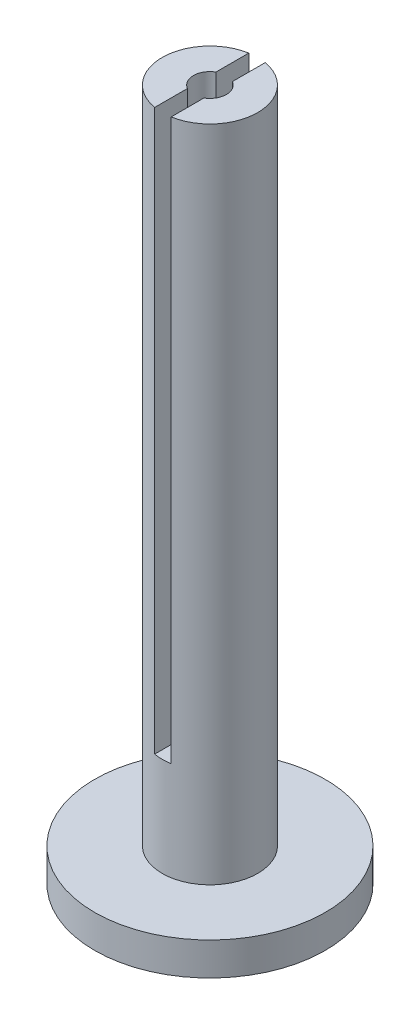
ISO-10303-21;
HEADER;
FILE_DESCRIPTION(('STEP AP214'),'2;1');
FILE_NAME('part.step','',(''),(''),'','','');
FILE_SCHEMA(('AUTOMOTIVE_DESIGN { 1 0 10303 214 1 1 1 1 }'));
ENDSEC;
DATA;
#1=APPLICATION_CONTEXT('core data for automotive mechanical design processes');
#2=APPLICATION_PROTOCOL_DEFINITION('international standard','automotive_design',2000,#1);
#3=PRODUCT_CONTEXT('',#1,'mechanical');
#4=PRODUCT('Part','Part','',(#3));
#5=PRODUCT_RELATED_PRODUCT_CATEGORY('part','',(#4));
#6=PRODUCT_DEFINITION_FORMATION('','',#4);
#7=PRODUCT_DEFINITION_CONTEXT('part definition',#1,'design');
#8=PRODUCT_DEFINITION('design','',#6,#7);
#9=PRODUCT_DEFINITION_SHAPE('','',#8);
#10=(LENGTH_UNIT() NAMED_UNIT(*) SI_UNIT(.MILLI.,.METRE.));
#11=(NAMED_UNIT(*) PLANE_ANGLE_UNIT() SI_UNIT($,.RADIAN.));
#12=(NAMED_UNIT(*) SI_UNIT($,.STERADIAN.) SOLID_ANGLE_UNIT());
#13=UNCERTAINTY_MEASURE_WITH_UNIT(LENGTH_MEASURE(1.E-05),#10,'distance_accuracy_value','');
#14=(GEOMETRIC_REPRESENTATION_CONTEXT(3) GLOBAL_UNCERTAINTY_ASSIGNED_CONTEXT((#13)) GLOBAL_UNIT_ASSIGNED_CONTEXT((#10,
#11,#12)) REPRESENTATION_CONTEXT('',''));
#15=CARTESIAN_POINT('',(0.,0.,0.));
#16=DIRECTION('',(0.,0.,1.));
#17=DIRECTION('',(1.,0.,0.));
#18=AXIS2_PLACEMENT_3D('',#15,#16,#17);
#19=CARTESIAN_POINT('',(-0.25,4.,-1.5));
#20=DIRECTION('',(-1.,0.,0.));
#21=DIRECTION('',(0.,0.,1.));
#22=AXIS2_PLACEMENT_3D('',#19,#20,#21);
#23=PLANE('',#22);
#24=DIRECTION('',(0.,0.,1.));
#25=VECTOR('',#24,1.);
#26=CARTESIAN_POINT('',(-0.25,4.,-1.5));
#27=LINE('',#26,#25);
#28=CARTESIAN_POINT('',(-0.25,4.,0.433012701892219));
#29=VERTEX_POINT('',#28);
#30=CARTESIAN_POINT('',(-0.25,4.,1.42828568570857));
#31=VERTEX_POINT('',#30);
#32=EDGE_CURVE('E148',#29,#31,#27,.T.);
#33=ORIENTED_EDGE('',*,*,#32,.F.);
#34=DIRECTION('',(0.,1.,0.));
#35=VECTOR('',#34,1.);
#36=CARTESIAN_POINT('',(-0.25,4.,0.433012701892219));
#37=LINE('',#36,#35);
#38=CARTESIAN_POINT('',(-0.25,21.,0.433012701892219));
#39=VERTEX_POINT('',#38);
#40=EDGE_CURVE('E214',#29,#39,#37,.T.);
#41=ORIENTED_EDGE('',*,*,#40,.T.);
#42=DIRECTION('',(0.,0.,1.));
#43=VECTOR('',#42,1.);
#44=CARTESIAN_POINT('',(-0.25,21.,0.));
#45=LINE('',#44,#43);
#46=CARTESIAN_POINT('',(-0.25,21.,1.42828568570857));
#47=VERTEX_POINT('',#46);
#48=EDGE_CURVE('E122',#39,#47,#45,.T.);
#49=ORIENTED_EDGE('',*,*,#48,.T.);
#50=DIRECTION('',(0.,-1.,0.));
#51=VECTOR('',#50,1.);
#52=CARTESIAN_POINT('',(-0.25,21.,1.42828568570857));
#53=LINE('',#52,#51);
#54=EDGE_CURVE('E143',#31,#47,#53,.F.);
#55=ORIENTED_EDGE('',*,*,#54,.F.);
#56=EDGE_LOOP('',(#33,#41,#49,#55));
#57=FACE_BOUND('',#56,.T.);
#58=ADVANCED_FACE('F39',(#57),#23,.F.);
#59=CARTESIAN_POINT('',(0.25,4.,-1.5));
#60=DIRECTION('',(1.,0.,0.));
#61=DIRECTION('',(0.,0.,-1.));
#62=AXIS2_PLACEMENT_3D('',#59,#60,#61);
#63=PLANE('',#62);
#64=DIRECTION('',(0.,0.,-1.));
#65=VECTOR('',#64,1.);
#66=CARTESIAN_POINT('',(0.25,4.,-1.5));
#67=LINE('',#66,#65);
#68=CARTESIAN_POINT('',(0.25,4.,-0.433012701892219));
#69=VERTEX_POINT('',#68);
#70=CARTESIAN_POINT('',(0.25,4.,-1.42828568570857));
#71=VERTEX_POINT('',#70);
#72=EDGE_CURVE('E150',#69,#71,#67,.T.);
#73=ORIENTED_EDGE('',*,*,#72,.F.);
#74=DIRECTION('',(0.,1.,0.));
#75=VECTOR('',#74,1.);
#76=CARTESIAN_POINT('',(0.25,4.,-0.433012701892219));
#77=LINE('',#76,#75);
#78=CARTESIAN_POINT('',(0.25,21.,-0.433012701892219));
#79=VERTEX_POINT('',#78);
#80=EDGE_CURVE('E11',#69,#79,#77,.T.);
#81=ORIENTED_EDGE('',*,*,#80,.T.);
#82=DIRECTION('',(0.,0.,-1.));
#83=VECTOR('',#82,1.);
#84=CARTESIAN_POINT('',(0.25,21.,0.));
#85=LINE('',#84,#83);
#86=CARTESIAN_POINT('',(0.25,21.,-1.42828568570857));
#87=VERTEX_POINT('',#86);
#88=EDGE_CURVE('E116',#79,#87,#85,.T.);
#89=ORIENTED_EDGE('',*,*,#88,.T.);
#90=DIRECTION('',(0.,-1.,0.));
#91=VECTOR('',#90,1.);
#92=CARTESIAN_POINT('',(0.25,21.,-1.42828568570857));
#93=LINE('',#92,#91);
#94=EDGE_CURVE('E149',#71,#87,#93,.F.);
#95=ORIENTED_EDGE('',*,*,#94,.F.);
#96=EDGE_LOOP('',(#73,#81,#89,#95));
#97=FACE_BOUND('',#96,.T.);
#98=ADVANCED_FACE('F185',(#97),#63,.F.);
#99=CARTESIAN_POINT('',(0.,21.,0.));
#100=DIRECTION('',(0.,1.,0.));
#101=DIRECTION('',(0.,0.,1.));
#102=AXIS2_PLACEMENT_3D('',#99,#100,#101);
#103=PLANE('',#102);
#104=CARTESIAN_POINT('',(0.,21.,0.));
#105=DIRECTION('',(0.,1.,0.));
#106=DIRECTION('',(0.,0.,1.));
#107=AXIS2_PLACEMENT_3D('',#104,#105,#106);
#108=CIRCLE('',#107,0.5);
#109=CARTESIAN_POINT('',(-0.25,21.,-0.433012701892219));
#110=VERTEX_POINT('',#109);
#111=EDGE_CURVE('E117',#110,#39,#108,.T.);
#112=ORIENTED_EDGE('',*,*,#111,.F.);
#113=CARTESIAN_POINT('',(-0.25,21.,-1.42828568570857));
#114=VERTEX_POINT('',#113);
#115=EDGE_CURVE('E124',#114,#110,#45,.T.);
#116=ORIENTED_EDGE('',*,*,#115,.F.);
#117=CARTESIAN_POINT('',(0.,21.,0.));
#118=DIRECTION('',(0.,1.,0.));
#119=DIRECTION('',(0.,0.,1.));
#120=AXIS2_PLACEMENT_3D('',#117,#118,#119);
#121=CIRCLE('',#120,1.45);
#122=EDGE_CURVE('E162',#114,#47,#121,.T.);
#123=ORIENTED_EDGE('',*,*,#122,.T.);
#124=ORIENTED_EDGE('',*,*,#48,.F.);
#125=EDGE_LOOP('',(#112,#116,#123,#124));
#126=FACE_BOUND('',#125,.T.);
#127=ADVANCED_FACE('F192',(#126),#103,.T.);
#128=CARTESIAN_POINT('',(0.,1.,0.));
#129=DIRECTION('',(0.,-1.,0.));
#130=DIRECTION('',(0.,0.,-1.));
#131=AXIS2_PLACEMENT_3D('',#128,#129,#130);
#132=CYLINDRICAL_SURFACE('',#131,3.5);
#133=CARTESIAN_POINT('',(0.,1.,0.));
#134=DIRECTION('',(0.,1.,0.));
#135=DIRECTION('',(0.,0.,1.));
#136=AXIS2_PLACEMENT_3D('',#133,#134,#135);
#137=CIRCLE('',#136,3.5);
#138=CARTESIAN_POINT('',(0.,1.,3.5));
#139=VERTEX_POINT('',#138);
#140=EDGE_CURVE('E166',#139,#139,#137,.T.);
#141=ORIENTED_EDGE('',*,*,#140,.F.);
#142=EDGE_LOOP('',(#141));
#143=FACE_BOUND('',#142,.T.);
#144=CARTESIAN_POINT('',(0.,0.,0.));
#145=DIRECTION('',(0.,1.,0.));
#146=DIRECTION('',(0.,0.,1.));
#147=AXIS2_PLACEMENT_3D('',#144,#145,#146);
#148=CIRCLE('',#147,3.5);
#149=CARTESIAN_POINT('',(0.,0.,3.5));
#150=VERTEX_POINT('',#149);
#151=EDGE_CURVE('E128',#150,#150,#148,.T.);
#152=ORIENTED_EDGE('',*,*,#151,.T.);
#153=EDGE_LOOP('',(#152));
#154=FACE_BOUND('',#153,.T.);
#155=ADVANCED_FACE('F41',(#143,#154),#132,.T.);
#156=CARTESIAN_POINT('',(0.,1.,0.));
#157=DIRECTION('',(0.,1.,0.));
#158=DIRECTION('',(0.,0.,1.));
#159=AXIS2_PLACEMENT_3D('',#156,#157,#158);
#160=PLANE('',#159);
#161=CARTESIAN_POINT('',(0.,1.,0.));
#162=DIRECTION('',(0.,1.,0.));
#163=DIRECTION('',(0.,0.,1.));
#164=AXIS2_PLACEMENT_3D('',#161,#162,#163);
#165=CIRCLE('',#164,1.45);
#166=CARTESIAN_POINT('',(0.,1.,1.45));
#167=VERTEX_POINT('',#166);
#168=EDGE_CURVE('E126',#167,#167,#165,.T.);
#169=ORIENTED_EDGE('',*,*,#168,.F.);
#170=EDGE_LOOP('',(#169));
#171=FACE_BOUND('',#170,.T.);
#172=ORIENTED_EDGE('',*,*,#140,.T.);
#173=EDGE_LOOP('',(#172));
#174=FACE_BOUND('',#173,.T.);
#175=ADVANCED_FACE('F176',(#171,#174),#160,.T.);
#176=CARTESIAN_POINT('',(0.,0.,0.));
#177=DIRECTION('',(0.,1.,0.));
#178=DIRECTION('',(0.,0.,1.));
#179=AXIS2_PLACEMENT_3D('',#176,#177,#178);
#180=PLANE('',#179);
#181=ORIENTED_EDGE('',*,*,#151,.F.);
#182=EDGE_LOOP('',(#181));
#183=FACE_BOUND('',#182,.T.);
#184=ADVANCED_FACE('F174',(#183),#180,.F.);
#185=CARTESIAN_POINT('',(0.,21.,0.));
#186=DIRECTION('',(0.,-1.,0.));
#187=DIRECTION('',(0.,0.,-1.));
#188=AXIS2_PLACEMENT_3D('',#185,#186,#187);
#189=CYLINDRICAL_SURFACE('',#188,1.45);
#190=CARTESIAN_POINT('',(0.,4.,0.));
#191=DIRECTION('',(0.,-1.,0.));
#192=DIRECTION('',(0.,0.,-1.));
#193=AXIS2_PLACEMENT_3D('',#190,#191,#192);
#194=CIRCLE('',#193,1.45);
#195=CARTESIAN_POINT('',(0.25,4.,1.42828568570857));
#196=VERTEX_POINT('',#195);
#197=EDGE_CURVE('E108',#196,#31,#194,.T.);
#198=ORIENTED_EDGE('',*,*,#197,.T.);
#199=ORIENTED_EDGE('',*,*,#54,.T.);
#200=ORIENTED_EDGE('',*,*,#122,.F.);
#201=DIRECTION('',(0.,-1.,0.));
#202=VECTOR('',#201,1.);
#203=CARTESIAN_POINT('',(-0.25,21.,-1.42828568570857));
#204=LINE('',#203,#202);
#205=CARTESIAN_POINT('',(-0.25,4.,-1.42828568570857));
#206=VERTEX_POINT('',#205);
#207=EDGE_CURVE('E160',#114,#206,#204,.T.);
#208=ORIENTED_EDGE('',*,*,#207,.T.);
#209=EDGE_CURVE('E132',#206,#71,#194,.T.);
#210=ORIENTED_EDGE('',*,*,#209,.T.);
#211=ORIENTED_EDGE('',*,*,#94,.T.);
#212=CARTESIAN_POINT('',(0.25,21.,1.42828568570857));
#213=VERTEX_POINT('',#212);
#214=EDGE_CURVE('E163',#213,#87,#121,.T.);
#215=ORIENTED_EDGE('',*,*,#214,.F.);
#216=DIRECTION('',(0.,-1.,0.));
#217=VECTOR('',#216,1.);
#218=CARTESIAN_POINT('',(0.25,21.,1.42828568570857));
#219=LINE('',#218,#217);
#220=EDGE_CURVE('E121',#213,#196,#219,.T.);
#221=ORIENTED_EDGE('',*,*,#220,.T.);
#222=EDGE_LOOP('',(#198,#199,#200,#208,#210,#211,#215,#221));
#223=FACE_BOUND('',#222,.T.);
#224=ORIENTED_EDGE('',*,*,#168,.T.);
#225=EDGE_LOOP('',(#224));
#226=FACE_BOUND('',#225,.T.);
#227=ADVANCED_FACE('F139',(#223,#226),#189,.T.);
#228=CARTESIAN_POINT('',(0.25,21.,0.433012701892219));
#229=VERTEX_POINT('',#228);
#230=EDGE_CURVE('E104',#229,#79,#108,.T.);
#231=ORIENTED_EDGE('',*,*,#230,.F.);
#232=EDGE_CURVE('E114',#213,#229,#85,.T.);
#233=ORIENTED_EDGE('',*,*,#232,.F.);
#234=ORIENTED_EDGE('',*,*,#214,.T.);
#235=ORIENTED_EDGE('',*,*,#88,.F.);
#236=EDGE_LOOP('',(#231,#233,#234,#235));
#237=FACE_BOUND('',#236,.T.);
#238=ADVANCED_FACE('F112',(#237),#103,.T.);
#239=CARTESIAN_POINT('',(0.,4.,0.));
#240=DIRECTION('',(0.,-1.,0.));
#241=DIRECTION('',(0.,0.,-1.));
#242=AXIS2_PLACEMENT_3D('',#239,#240,#241);
#243=PLANE('',#242);
#244=CARTESIAN_POINT('',(-0.25,4.,-0.433012701892219));
#245=VERTEX_POINT('',#244);
#246=EDGE_CURVE('E153',#206,#245,#27,.T.);
#247=ORIENTED_EDGE('',*,*,#246,.T.);
#248=CARTESIAN_POINT('',(0.,4.,0.));
#249=DIRECTION('',(0.,1.,0.));
#250=DIRECTION('',(0.,0.,1.));
#251=AXIS2_PLACEMENT_3D('',#248,#249,#250);
#252=CIRCLE('',#251,0.5);
#253=EDGE_CURVE('E54',#245,#29,#252,.T.);
#254=ORIENTED_EDGE('',*,*,#253,.T.);
#255=ORIENTED_EDGE('',*,*,#32,.T.);
#256=ORIENTED_EDGE('',*,*,#197,.F.);
#257=CARTESIAN_POINT('',(0.25,4.,0.433012701892219));
#258=VERTEX_POINT('',#257);
#259=EDGE_CURVE('E146',#196,#258,#67,.T.);
#260=ORIENTED_EDGE('',*,*,#259,.T.);
#261=EDGE_CURVE('E61',#258,#69,#252,.T.);
#262=ORIENTED_EDGE('',*,*,#261,.T.);
#263=ORIENTED_EDGE('',*,*,#72,.T.);
#264=ORIENTED_EDGE('',*,*,#209,.F.);
#265=EDGE_LOOP('',(#247,#254,#255,#256,#260,#262,#263,#264));
#266=FACE_BOUND('',#265,.T.);
#267=ADVANCED_FACE('F145',(#266),#243,.F.);
#268=ORIENTED_EDGE('',*,*,#115,.T.);
#269=DIRECTION('',(0.,1.,0.));
#270=VECTOR('',#269,1.);
#271=CARTESIAN_POINT('',(-0.25,4.,-0.433012701892219));
#272=LINE('',#271,#270);
#273=EDGE_CURVE('E206',#110,#245,#272,.F.);
#274=ORIENTED_EDGE('',*,*,#273,.T.);
#275=ORIENTED_EDGE('',*,*,#246,.F.);
#276=ORIENTED_EDGE('',*,*,#207,.F.);
#277=EDGE_LOOP('',(#268,#274,#275,#276));
#278=FACE_BOUND('',#277,.T.);
#279=ADVANCED_FACE('F188',(#278),#23,.F.);
#280=ORIENTED_EDGE('',*,*,#232,.T.);
#281=DIRECTION('',(0.,1.,0.));
#282=VECTOR('',#281,1.);
#283=CARTESIAN_POINT('',(0.25,4.,0.433012701892219));
#284=LINE('',#283,#282);
#285=EDGE_CURVE('E47',#229,#258,#284,.F.);
#286=ORIENTED_EDGE('',*,*,#285,.T.);
#287=ORIENTED_EDGE('',*,*,#259,.F.);
#288=ORIENTED_EDGE('',*,*,#220,.F.);
#289=EDGE_LOOP('',(#280,#286,#287,#288));
#290=FACE_BOUND('',#289,.T.);
#291=ADVANCED_FACE('F119',(#290),#63,.F.);
#292=CARTESIAN_POINT('',(0.,4.,0.));
#293=DIRECTION('',(0.,1.,0.));
#294=DIRECTION('',(0.,0.,1.));
#295=AXIS2_PLACEMENT_3D('',#292,#293,#294);
#296=CYLINDRICAL_SURFACE('',#295,0.5);
#297=ORIENTED_EDGE('',*,*,#261,.F.);
#298=ORIENTED_EDGE('',*,*,#285,.F.);
#299=ORIENTED_EDGE('',*,*,#230,.T.);
#300=ORIENTED_EDGE('',*,*,#80,.F.);
#301=EDGE_LOOP('',(#297,#298,#299,#300));
#302=FACE_BOUND('',#301,.T.);
#303=ADVANCED_FACE('F103',(#302),#296,.F.);
#304=ORIENTED_EDGE('',*,*,#253,.F.);
#305=ORIENTED_EDGE('',*,*,#273,.F.);
#306=ORIENTED_EDGE('',*,*,#111,.T.);
#307=ORIENTED_EDGE('',*,*,#40,.F.);
#308=EDGE_LOOP('',(#304,#305,#306,#307));
#309=FACE_BOUND('',#308,.T.);
#310=ADVANCED_FACE('F217',(#309),#296,.F.);
#311=CLOSED_SHELL('',(#58,#98,#127,#155,#175,#184,#227,#238,#267,#279,#291,#303,#310));
#312=MANIFOLD_SOLID_BREP('B2',#311);
#313=ADVANCED_BREP_SHAPE_REPRESENTATION('',(#18,#312),#14);
#314=SHAPE_DEFINITION_REPRESENTATION(#9,#313);
ENDSEC;
END-ISO-10303-21;
